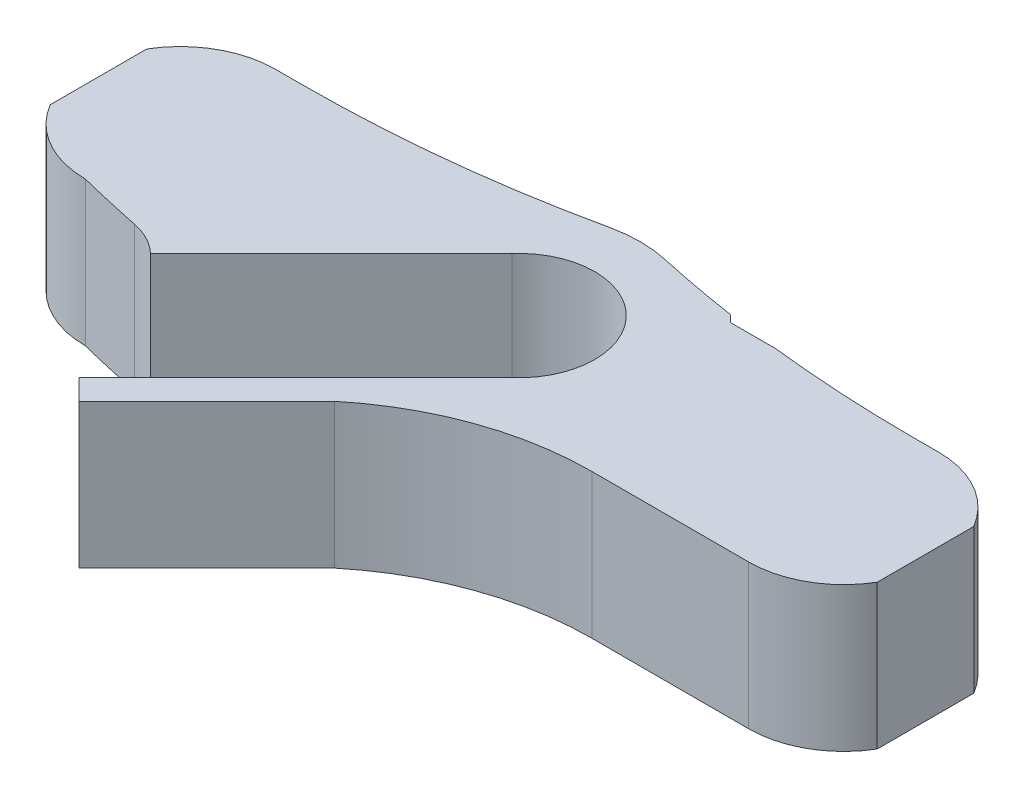
ISO-10303-21;
HEADER;
FILE_DESCRIPTION(('STEP AP214'),'2;1');
FILE_NAME('part.step','',(''),(''),'','','');
FILE_SCHEMA(('AUTOMOTIVE_DESIGN { 1 0 10303 214 1 1 1 1 }'));
ENDSEC;
DATA;
#1=APPLICATION_CONTEXT('core data for automotive mechanical design processes');
#2=APPLICATION_PROTOCOL_DEFINITION('international standard','automotive_design',2000,#1);
#3=PRODUCT_CONTEXT('',#1,'mechanical');
#4=PRODUCT('Part','Part','',(#3));
#5=PRODUCT_RELATED_PRODUCT_CATEGORY('part','',(#4));
#6=PRODUCT_DEFINITION_FORMATION('','',#4);
#7=PRODUCT_DEFINITION_CONTEXT('part definition',#1,'design');
#8=PRODUCT_DEFINITION('design','',#6,#7);
#9=PRODUCT_DEFINITION_SHAPE('','',#8);
#10=(LENGTH_UNIT() NAMED_UNIT(*) SI_UNIT(.MILLI.,.METRE.));
#11=(NAMED_UNIT(*) PLANE_ANGLE_UNIT() SI_UNIT($,.RADIAN.));
#12=(NAMED_UNIT(*) SI_UNIT($,.STERADIAN.) SOLID_ANGLE_UNIT());
#13=UNCERTAINTY_MEASURE_WITH_UNIT(LENGTH_MEASURE(1.E-05),#10,'distance_accuracy_value','');
#14=(GEOMETRIC_REPRESENTATION_CONTEXT(3) GLOBAL_UNCERTAINTY_ASSIGNED_CONTEXT((#13)) GLOBAL_UNIT_ASSIGNED_CONTEXT((#10,
#11,#12)) REPRESENTATION_CONTEXT('',''));
#15=CARTESIAN_POINT('',(0.,0.,0.));
#16=DIRECTION('',(0.,0.,1.));
#17=DIRECTION('',(1.,0.,0.));
#18=AXIS2_PLACEMENT_3D('',#15,#16,#17);
#19=CARTESIAN_POINT('',(46.2675514036826,10.5,28.5920986413207));
#20=DIRECTION('',(0.,-1.,0.));
#21=DIRECTION('',(0.,0.,-1.));
#22=AXIS2_PLACEMENT_3D('',#19,#20,#21);
#23=CYLINDRICAL_SURFACE('',#22,21.685333675265);
#24=CARTESIAN_POINT('',(46.2675514036826,0.,28.5920986413207));
#25=DIRECTION('',(0.,1.,0.));
#26=DIRECTION('',(0.,0.,1.));
#27=AXIS2_PLACEMENT_3D('',#24,#25,#26);
#28=CIRCLE('',#27,21.685333675265);
#29=CARTESIAN_POINT('',(46.2675514036826,0.,6.90676496605569));
#30=VERTEX_POINT('',#29);
#31=CARTESIAN_POINT('',(32.4923497371638,0.,11.8440385848747));
#32=VERTEX_POINT('',#31);
#33=EDGE_CURVE('E391',#30,#32,#28,.T.);
#34=ORIENTED_EDGE('',*,*,#33,.F.);
#35=DIRECTION('',(0.,-1.,0.));
#36=VECTOR('',#35,1.);
#37=CARTESIAN_POINT('',(46.2675514036826,10.5,6.90676496605569));
#38=LINE('',#37,#36);
#39=CARTESIAN_POINT('',(46.2675514036826,10.5,6.90676496605569));
#40=VERTEX_POINT('',#39);
#41=EDGE_CURVE('E518',#40,#30,#38,.T.);
#42=ORIENTED_EDGE('',*,*,#41,.F.);
#43=CARTESIAN_POINT('',(46.2675514036826,10.5,28.5920986413207));
#44=DIRECTION('',(0.,1.,0.));
#45=DIRECTION('',(0.,0.,1.));
#46=AXIS2_PLACEMENT_3D('',#43,#44,#45);
#47=CIRCLE('',#46,21.685333675265);
#48=CARTESIAN_POINT('',(32.4923497371638,10.5,11.8440385848747));
#49=VERTEX_POINT('',#48);
#50=EDGE_CURVE('E326',#40,#49,#47,.T.);
#51=ORIENTED_EDGE('',*,*,#50,.T.);
#52=DIRECTION('',(0.,-1.,0.));
#53=VECTOR('',#52,1.);
#54=CARTESIAN_POINT('',(32.4923497371638,10.5,11.8440385848747));
#55=LINE('',#54,#53);
#56=EDGE_CURVE('E292',#49,#32,#55,.T.);
#57=ORIENTED_EDGE('',*,*,#56,.T.);
#58=EDGE_LOOP('',(#34,#42,#51,#57));
#59=FACE_BOUND('',#58,.T.);
#60=ADVANCED_FACE('F125',(#59),#23,.F.);
#61=CARTESIAN_POINT('',(0.,10.5,6.90676496605569));
#62=DIRECTION('',(0.,0.,1.));
#63=DIRECTION('',(1.,0.,0.));
#64=AXIS2_PLACEMENT_3D('',#61,#62,#63);
#65=PLANE('',#64);
#66=DIRECTION('',(-1.,0.,0.));
#67=VECTOR('',#66,1.);
#68=CARTESIAN_POINT('',(0.,0.,6.90676496605569));
#69=LINE('',#68,#67);
#70=CARTESIAN_POINT('',(57.65,0.,6.90676496605569));
#71=VERTEX_POINT('',#70);
#72=EDGE_CURVE('E395',#71,#30,#69,.T.);
#73=ORIENTED_EDGE('',*,*,#72,.F.);
#74=DIRECTION('',(0.,-1.,0.));
#75=VECTOR('',#74,1.);
#76=CARTESIAN_POINT('',(57.65,10.5,6.90676496605569));
#77=LINE('',#76,#75);
#78=CARTESIAN_POINT('',(57.65,10.5,6.90676496605569));
#79=VERTEX_POINT('',#78);
#80=EDGE_CURVE('E515',#79,#71,#77,.T.);
#81=ORIENTED_EDGE('',*,*,#80,.F.);
#82=DIRECTION('',(-1.,0.,0.));
#83=VECTOR('',#82,1.);
#84=CARTESIAN_POINT('',(0.,10.5,6.90676496605569));
#85=LINE('',#84,#83);
#86=EDGE_CURVE('E330',#79,#40,#85,.T.);
#87=ORIENTED_EDGE('',*,*,#86,.T.);
#88=ORIENTED_EDGE('',*,*,#41,.T.);
#89=EDGE_LOOP('',(#73,#81,#87,#88));
#90=FACE_BOUND('',#89,.T.);
#91=ADVANCED_FACE('F555',(#90),#65,.T.);
#92=CARTESIAN_POINT('',(57.65,10.5,0.));
#93=DIRECTION('',(0.,-1.,0.));
#94=DIRECTION('',(0.,0.,-1.));
#95=AXIS2_PLACEMENT_3D('',#92,#93,#94);
#96=CYLINDRICAL_SURFACE('',#95,6.90676496605569);
#97=CARTESIAN_POINT('',(57.65,0.,0.));
#98=DIRECTION('',(0.,1.,0.));
#99=DIRECTION('',(0.,0.,1.));
#100=AXIS2_PLACEMENT_3D('',#97,#98,#99);
#101=CIRCLE('',#100,6.90676496605569);
#102=CARTESIAN_POINT('',(63.6,0.,3.50726421820973));
#103=VERTEX_POINT('',#102);
#104=EDGE_CURVE('E400',#71,#103,#101,.T.);
#105=ORIENTED_EDGE('',*,*,#104,.T.);
#106=DIRECTION('',(0.,-1.,0.));
#107=VECTOR('',#106,1.);
#108=CARTESIAN_POINT('',(63.6,10.5,3.50726421820973));
#109=LINE('',#108,#107);
#110=CARTESIAN_POINT('',(63.6,10.5,3.50726421820973));
#111=VERTEX_POINT('',#110);
#112=EDGE_CURVE('E512',#111,#103,#109,.T.);
#113=ORIENTED_EDGE('',*,*,#112,.F.);
#114=CARTESIAN_POINT('',(57.65,10.5,0.));
#115=DIRECTION('',(0.,1.,0.));
#116=DIRECTION('',(0.,0.,1.));
#117=AXIS2_PLACEMENT_3D('',#114,#115,#116);
#118=CIRCLE('',#117,6.90676496605569);
#119=EDGE_CURVE('E334',#79,#111,#118,.T.);
#120=ORIENTED_EDGE('',*,*,#119,.F.);
#121=ORIENTED_EDGE('',*,*,#80,.T.);
#122=EDGE_LOOP('',(#105,#113,#120,#121));
#123=FACE_BOUND('',#122,.T.);
#124=ADVANCED_FACE('F560',(#123),#96,.T.);
#125=CARTESIAN_POINT('',(63.6,10.5,0.));
#126=DIRECTION('',(1.,0.,0.));
#127=DIRECTION('',(0.,0.,-1.));
#128=AXIS2_PLACEMENT_3D('',#125,#126,#127);
#129=PLANE('',#128);
#130=DIRECTION('',(0.,0.,1.));
#131=VECTOR('',#130,1.);
#132=CARTESIAN_POINT('',(63.6,0.,0.));
#133=LINE('',#132,#131);
#134=CARTESIAN_POINT('',(63.6,0.,-3.50726421820973));
#135=VERTEX_POINT('',#134);
#136=EDGE_CURVE('E404',#135,#103,#133,.T.);
#137=ORIENTED_EDGE('',*,*,#136,.F.);
#138=DIRECTION('',(0.,-1.,0.));
#139=VECTOR('',#138,1.);
#140=CARTESIAN_POINT('',(63.6,10.5,-3.50726421820973));
#141=LINE('',#140,#139);
#142=CARTESIAN_POINT('',(63.6,10.5,-3.50726421820973));
#143=VERTEX_POINT('',#142);
#144=EDGE_CURVE('E509',#143,#135,#141,.T.);
#145=ORIENTED_EDGE('',*,*,#144,.F.);
#146=DIRECTION('',(0.,0.,1.));
#147=VECTOR('',#146,1.);
#148=CARTESIAN_POINT('',(63.6,10.5,0.));
#149=LINE('',#148,#147);
#150=EDGE_CURVE('E337',#143,#111,#149,.T.);
#151=ORIENTED_EDGE('',*,*,#150,.T.);
#152=ORIENTED_EDGE('',*,*,#112,.T.);
#153=EDGE_LOOP('',(#137,#145,#151,#152));
#154=FACE_BOUND('',#153,.T.);
#155=ADVANCED_FACE('F564',(#154),#129,.T.);
#156=CARTESIAN_POINT('',(57.65,10.5,0.));
#157=DIRECTION('',(0.,-1.,0.));
#158=DIRECTION('',(0.,0.,-1.));
#159=AXIS2_PLACEMENT_3D('',#156,#157,#158);
#160=CYLINDRICAL_SURFACE('',#159,6.90676496605569);
#161=CARTESIAN_POINT('',(57.65,0.,0.));
#162=DIRECTION('',(0.,1.,0.));
#163=DIRECTION('',(0.,0.,1.));
#164=AXIS2_PLACEMENT_3D('',#161,#162,#163);
#165=CIRCLE('',#164,6.90676496605569);
#166=CARTESIAN_POINT('',(57.65,0.,-6.90676496605569));
#167=VERTEX_POINT('',#166);
#168=EDGE_CURVE('E408',#135,#167,#165,.T.);
#169=ORIENTED_EDGE('',*,*,#168,.T.);
#170=DIRECTION('',(0.,-1.,0.));
#171=VECTOR('',#170,1.);
#172=CARTESIAN_POINT('',(57.65,10.5,-6.90676496605569));
#173=LINE('',#172,#171);
#174=CARTESIAN_POINT('',(57.65,10.5,-6.90676496605569));
#175=VERTEX_POINT('',#174);
#176=EDGE_CURVE('E505',#175,#167,#173,.T.);
#177=ORIENTED_EDGE('',*,*,#176,.F.);
#178=CARTESIAN_POINT('',(57.65,10.5,0.));
#179=DIRECTION('',(0.,1.,0.));
#180=DIRECTION('',(0.,0.,1.));
#181=AXIS2_PLACEMENT_3D('',#178,#179,#180);
#182=CIRCLE('',#181,6.90676496605569);
#183=EDGE_CURVE('E341',#143,#175,#182,.T.);
#184=ORIENTED_EDGE('',*,*,#183,.F.);
#185=ORIENTED_EDGE('',*,*,#144,.T.);
#186=EDGE_LOOP('',(#169,#177,#184,#185));
#187=FACE_BOUND('',#186,.T.);
#188=ADVANCED_FACE('F569',(#187),#160,.T.);
#189=CARTESIAN_POINT('',(0.,10.5,-6.90676496605561));
#190=DIRECTION('',(0.,0.,1.));
#191=DIRECTION('',(1.,0.,0.));
#192=AXIS2_PLACEMENT_3D('',#189,#190,#191);
#193=PLANE('',#192);
#194=DIRECTION('',(-1.,0.,0.));
#195=VECTOR('',#194,1.);
#196=CARTESIAN_POINT('',(0.,0.,-6.90676496605561));
#197=LINE('',#196,#195);
#198=CARTESIAN_POINT('',(55.7709312115132,0.,-6.90676496605569));
#199=VERTEX_POINT('',#198);
#200=EDGE_CURVE('E411',#167,#199,#197,.T.);
#201=ORIENTED_EDGE('',*,*,#200,.T.);
#202=DIRECTION('',(0.,-1.,0.));
#203=VECTOR('',#202,1.);
#204=CARTESIAN_POINT('',(55.7709312115132,10.5,-6.90676496605569));
#205=LINE('',#204,#203);
#206=CARTESIAN_POINT('',(55.7709312115132,10.5,-6.90676496605569));
#207=VERTEX_POINT('',#206);
#208=EDGE_CURVE('E502',#207,#199,#205,.T.);
#209=ORIENTED_EDGE('',*,*,#208,.F.);
#210=DIRECTION('',(-1.,0.,0.));
#211=VECTOR('',#210,1.);
#212=CARTESIAN_POINT('',(0.,10.5,-6.90676496605561));
#213=LINE('',#212,#211);
#214=EDGE_CURVE('E344',#175,#207,#213,.T.);
#215=ORIENTED_EDGE('',*,*,#214,.F.);
#216=ORIENTED_EDGE('',*,*,#176,.T.);
#217=EDGE_LOOP('',(#201,#209,#215,#216));
#218=FACE_BOUND('',#217,.T.);
#219=ADVANCED_FACE('F575',(#218),#193,.F.);
#220=CARTESIAN_POINT('',(55.7709312115132,10.5,-101.406764966056));
#221=DIRECTION('',(0.,-1.,0.));
#222=DIRECTION('',(0.,0.,-1.));
#223=AXIS2_PLACEMENT_3D('',#220,#221,#222);
#224=CYLINDRICAL_SURFACE('',#223,94.5);
#225=CARTESIAN_POINT('',(55.7709312115132,0.,-101.406764966056));
#226=DIRECTION('',(0.,1.,0.));
#227=DIRECTION('',(0.,0.,1.));
#228=AXIS2_PLACEMENT_3D('',#225,#226,#227);
#229=CIRCLE('',#228,94.5);
#230=CARTESIAN_POINT('',(45.1988219796724,0.,-7.49999999999999));
#231=VERTEX_POINT('',#230);
#232=EDGE_CURVE('E415',#231,#199,#229,.T.);
#233=ORIENTED_EDGE('',*,*,#232,.F.);
#234=DIRECTION('',(0.,-1.,0.));
#235=VECTOR('',#234,1.);
#236=CARTESIAN_POINT('',(45.1988219796724,10.5,-7.49999999999999));
#237=LINE('',#236,#235);
#238=CARTESIAN_POINT('',(45.1988219796724,10.5,-7.49999999999999));
#239=VERTEX_POINT('',#238);
#240=EDGE_CURVE('E499',#239,#231,#237,.T.);
#241=ORIENTED_EDGE('',*,*,#240,.F.);
#242=CARTESIAN_POINT('',(55.7709312115132,10.5,-101.406764966056));
#243=DIRECTION('',(0.,1.,0.));
#244=DIRECTION('',(0.,0.,1.));
#245=AXIS2_PLACEMENT_3D('',#242,#243,#244);
#246=CIRCLE('',#245,94.5);
#247=EDGE_CURVE('E347',#239,#207,#246,.T.);
#248=ORIENTED_EDGE('',*,*,#247,.T.);
#249=ORIENTED_EDGE('',*,*,#208,.T.);
#250=EDGE_LOOP('',(#233,#241,#248,#249));
#251=FACE_BOUND('',#250,.T.);
#252=ADVANCED_FACE('F579',(#251),#224,.F.);
#253=CARTESIAN_POINT('',(0.,10.5,-7.5));
#254=DIRECTION('',(0.,0.,-1.));
#255=DIRECTION('',(-1.,0.,0.));
#256=AXIS2_PLACEMENT_3D('',#253,#254,#255);
#257=PLANE('',#256);
#258=DIRECTION('',(1.,0.,0.));
#259=VECTOR('',#258,1.);
#260=CARTESIAN_POINT('',(0.,0.,-7.5));
#261=LINE('',#260,#259);
#262=CARTESIAN_POINT('',(41.924547237638,0.,-7.5));
#263=VERTEX_POINT('',#262);
#264=EDGE_CURVE('E419',#263,#231,#261,.T.);
#265=ORIENTED_EDGE('',*,*,#264,.F.);
#266=DIRECTION('',(0.,-1.,0.));
#267=VECTOR('',#266,1.);
#268=CARTESIAN_POINT('',(41.924547237638,10.5,-7.5));
#269=LINE('',#268,#267);
#270=CARTESIAN_POINT('',(41.924547237638,10.5,-7.5));
#271=VERTEX_POINT('',#270);
#272=EDGE_CURVE('E496',#271,#263,#269,.T.);
#273=ORIENTED_EDGE('',*,*,#272,.F.);
#274=DIRECTION('',(1.,0.,0.));
#275=VECTOR('',#274,1.);
#276=CARTESIAN_POINT('',(0.,10.5,-7.5));
#277=LINE('',#276,#275);
#278=EDGE_CURVE('E351',#271,#239,#277,.T.);
#279=ORIENTED_EDGE('',*,*,#278,.T.);
#280=ORIENTED_EDGE('',*,*,#240,.T.);
#281=EDGE_LOOP('',(#265,#273,#279,#280));
#282=FACE_BOUND('',#281,.T.);
#283=ADVANCED_FACE('F582',(#282),#257,.T.);
#284=CARTESIAN_POINT('',(24.7122736188192,10.5,-24.712273618819));
#285=DIRECTION('',(0.707106781186551,0.,-0.707106781186544));
#286=DIRECTION('',(-0.707106781186544,0.,-0.707106781186551));
#287=AXIS2_PLACEMENT_3D('',#284,#285,#286);
#288=PLANE('',#287);
#289=DIRECTION('',(0.707106781186544,0.,0.707106781186551));
#290=VECTOR('',#289,1.);
#291=CARTESIAN_POINT('',(24.7122736188192,0.,-24.712273618819));
#292=LINE('',#291,#290);
#293=CARTESIAN_POINT('',(41.4220650406924,0.,-8.00248219694561));
#294=VERTEX_POINT('',#293);
#295=EDGE_CURVE('E423',#294,#263,#292,.T.);
#296=ORIENTED_EDGE('',*,*,#295,.F.);
#297=DIRECTION('',(0.,-1.,0.));
#298=VECTOR('',#297,1.);
#299=CARTESIAN_POINT('',(41.4220650406924,10.5,-8.00248219694561));
#300=LINE('',#299,#298);
#301=CARTESIAN_POINT('',(41.4220650406924,10.5,-8.00248219694561));
#302=VERTEX_POINT('',#301);
#303=EDGE_CURVE('E493',#302,#294,#300,.T.);
#304=ORIENTED_EDGE('',*,*,#303,.F.);
#305=DIRECTION('',(0.707106781186544,0.,0.707106781186551));
#306=VECTOR('',#305,1.);
#307=CARTESIAN_POINT('',(24.7122736188192,10.5,-24.712273618819));
#308=LINE('',#307,#306);
#309=EDGE_CURVE('E355',#302,#271,#308,.T.);
#310=ORIENTED_EDGE('',*,*,#309,.T.);
#311=ORIENTED_EDGE('',*,*,#272,.T.);
#312=EDGE_LOOP('',(#296,#304,#310,#311));
#313=FACE_BOUND('',#312,.T.);
#314=ADVANCED_FACE('F587',(#313),#288,.T.);
#315=CARTESIAN_POINT('',(55.7709312115132,10.5,-101.406764966056));
#316=DIRECTION('',(0.,-1.,0.));
#317=DIRECTION('',(0.,0.,-1.));
#318=AXIS2_PLACEMENT_3D('',#315,#316,#317);
#319=CYLINDRICAL_SURFACE('',#318,94.5);
#320=CARTESIAN_POINT('',(55.7709312115132,0.,-101.406764966056));
#321=DIRECTION('',(0.,1.,0.));
#322=DIRECTION('',(0.,0.,1.));
#323=AXIS2_PLACEMENT_3D('',#320,#321,#322);
#324=CIRCLE('',#323,94.5);
#325=CARTESIAN_POINT('',(35.5433910765038,0.,-9.09697881048829));
#326=VERTEX_POINT('',#325);
#327=EDGE_CURVE('E427',#326,#294,#324,.T.);
#328=ORIENTED_EDGE('',*,*,#327,.F.);
#329=DIRECTION('',(0.,-1.,0.));
#330=VECTOR('',#329,1.);
#331=CARTESIAN_POINT('',(35.5433910765038,10.5,-9.09697881048829));
#332=LINE('',#331,#330);
#333=CARTESIAN_POINT('',(35.5433910765038,10.5,-9.09697881048829));
#334=VERTEX_POINT('',#333);
#335=EDGE_CURVE('E490',#334,#326,#332,.T.);
#336=ORIENTED_EDGE('',*,*,#335,.F.);
#337=CARTESIAN_POINT('',(55.7709312115132,10.5,-101.406764966056));
#338=DIRECTION('',(0.,1.,0.));
#339=DIRECTION('',(0.,0.,1.));
#340=AXIS2_PLACEMENT_3D('',#337,#338,#339);
#341=CIRCLE('',#340,94.5);
#342=EDGE_CURVE('E359',#334,#302,#341,.T.);
#343=ORIENTED_EDGE('',*,*,#342,.T.);
#344=ORIENTED_EDGE('',*,*,#303,.T.);
#345=EDGE_LOOP('',(#328,#336,#343,#344));
#346=FACE_BOUND('',#345,.T.);
#347=ADVANCED_FACE('F590',(#346),#319,.F.);
#348=CARTESIAN_POINT('',(33.55,10.5,0.));
#349=DIRECTION('',(0.,-1.,0.));
#350=DIRECTION('',(0.,0.,-1.));
#351=AXIS2_PLACEMENT_3D('',#348,#349,#350);
#352=CYLINDRICAL_SURFACE('',#351,9.312820811245);
#353=CARTESIAN_POINT('',(33.55,0.,0.));
#354=DIRECTION('',(0.,1.,0.));
#355=DIRECTION('',(0.,0.,1.));
#356=AXIS2_PLACEMENT_3D('',#353,#354,#355);
#357=CIRCLE('',#356,9.312820811245);
#358=CARTESIAN_POINT('',(31.5566089234962,0.,-9.09697881048831));
#359=VERTEX_POINT('',#358);
#360=EDGE_CURVE('E431',#326,#359,#357,.T.);
#361=ORIENTED_EDGE('',*,*,#360,.T.);
#362=DIRECTION('',(0.,-1.,0.));
#363=VECTOR('',#362,1.);
#364=CARTESIAN_POINT('',(31.5566089234962,10.5,-9.09697881048831));
#365=LINE('',#364,#363);
#366=CARTESIAN_POINT('',(31.5566089234962,10.5,-9.09697881048831));
#367=VERTEX_POINT('',#366);
#368=EDGE_CURVE('E487',#367,#359,#365,.T.);
#369=ORIENTED_EDGE('',*,*,#368,.F.);
#370=CARTESIAN_POINT('',(33.55,10.5,0.));
#371=DIRECTION('',(0.,1.,0.));
#372=DIRECTION('',(0.,0.,1.));
#373=AXIS2_PLACEMENT_3D('',#370,#371,#372);
#374=CIRCLE('',#373,9.312820811245);
#375=EDGE_CURVE('E363',#334,#367,#374,.T.);
#376=ORIENTED_EDGE('',*,*,#375,.F.);
#377=ORIENTED_EDGE('',*,*,#335,.T.);
#378=EDGE_LOOP('',(#361,#369,#376,#377));
#379=FACE_BOUND('',#378,.T.);
#380=ADVANCED_FACE('F596',(#379),#352,.T.);
#381=CARTESIAN_POINT('',(11.3290687884867,10.5,-101.406764966056));
#382=DIRECTION('',(0.,-1.,0.));
#383=DIRECTION('',(0.,0.,-1.));
#384=AXIS2_PLACEMENT_3D('',#381,#382,#383);
#385=CYLINDRICAL_SURFACE('',#384,94.5);
#386=CARTESIAN_POINT('',(11.3290687884867,0.,-101.406764966056));
#387=DIRECTION('',(0.,1.,0.));
#388=DIRECTION('',(0.,0.,1.));
#389=AXIS2_PLACEMENT_3D('',#386,#387,#388);
#390=CIRCLE('',#389,94.5);
#391=CARTESIAN_POINT('',(11.3290687884868,0.,-6.90676496605569));
#392=VERTEX_POINT('',#391);
#393=EDGE_CURVE('E435',#392,#359,#390,.T.);
#394=ORIENTED_EDGE('',*,*,#393,.F.);
#395=DIRECTION('',(0.,-1.,0.));
#396=VECTOR('',#395,1.);
#397=CARTESIAN_POINT('',(11.3290687884868,10.5,-6.90676496605569));
#398=LINE('',#397,#396);
#399=CARTESIAN_POINT('',(11.3290687884868,10.5,-6.90676496605569));
#400=VERTEX_POINT('',#399);
#401=EDGE_CURVE('E484',#400,#392,#398,.T.);
#402=ORIENTED_EDGE('',*,*,#401,.F.);
#403=CARTESIAN_POINT('',(11.3290687884867,10.5,-101.406764966056));
#404=DIRECTION('',(0.,1.,0.));
#405=DIRECTION('',(0.,0.,1.));
#406=AXIS2_PLACEMENT_3D('',#403,#404,#405);
#407=CIRCLE('',#406,94.5);
#408=EDGE_CURVE('E366',#400,#367,#407,.T.);
#409=ORIENTED_EDGE('',*,*,#408,.T.);
#410=ORIENTED_EDGE('',*,*,#368,.T.);
#411=EDGE_LOOP('',(#394,#402,#409,#410));
#412=FACE_BOUND('',#411,.T.);
#413=ADVANCED_FACE('F600',(#412),#385,.F.);
#414=CARTESIAN_POINT('',(0.,10.5,-6.90676496605569));
#415=DIRECTION('',(0.,0.,-1.));
#416=DIRECTION('',(-1.,0.,0.));
#417=AXIS2_PLACEMENT_3D('',#414,#415,#416);
#418=PLANE('',#417);
#419=DIRECTION('',(1.,0.,0.));
#420=VECTOR('',#419,1.);
#421=CARTESIAN_POINT('',(0.,0.,-6.90676496605569));
#422=LINE('',#421,#420);
#423=CARTESIAN_POINT('',(9.45000000000001,0.,-6.90676496605569));
#424=VERTEX_POINT('',#423);
#425=EDGE_CURVE('E439',#424,#392,#422,.T.);
#426=ORIENTED_EDGE('',*,*,#425,.F.);
#427=DIRECTION('',(0.,-1.,0.));
#428=VECTOR('',#427,1.);
#429=CARTESIAN_POINT('',(9.45000000000001,10.5,-6.90676496605569));
#430=LINE('',#429,#428);
#431=CARTESIAN_POINT('',(9.45000000000001,10.5,-6.90676496605569));
#432=VERTEX_POINT('',#431);
#433=EDGE_CURVE('E481',#432,#424,#430,.T.);
#434=ORIENTED_EDGE('',*,*,#433,.F.);
#435=DIRECTION('',(1.,0.,0.));
#436=VECTOR('',#435,1.);
#437=CARTESIAN_POINT('',(0.,10.5,-6.90676496605569));
#438=LINE('',#437,#436);
#439=EDGE_CURVE('E370',#432,#400,#438,.T.);
#440=ORIENTED_EDGE('',*,*,#439,.T.);
#441=ORIENTED_EDGE('',*,*,#401,.T.);
#442=EDGE_LOOP('',(#426,#434,#440,#441));
#443=FACE_BOUND('',#442,.T.);
#444=ADVANCED_FACE('F603',(#443),#418,.T.);
#445=CARTESIAN_POINT('',(9.45000000000001,10.5,0.));
#446=DIRECTION('',(0.,-1.,0.));
#447=DIRECTION('',(0.,0.,-1.));
#448=AXIS2_PLACEMENT_3D('',#445,#446,#447);
#449=CYLINDRICAL_SURFACE('',#448,6.9067649660557);
#450=CARTESIAN_POINT('',(9.45000000000001,0.,0.));
#451=DIRECTION('',(0.,1.,0.));
#452=DIRECTION('',(0.,0.,1.));
#453=AXIS2_PLACEMENT_3D('',#450,#451,#452);
#454=CIRCLE('',#453,6.9067649660557);
#455=CARTESIAN_POINT('',(3.5,0.,-3.50726421820971));
#456=VERTEX_POINT('',#455);
#457=EDGE_CURVE('E443',#456,#424,#454,.F.);
#458=ORIENTED_EDGE('',*,*,#457,.F.);
#459=DIRECTION('',(0.,-1.,0.));
#460=VECTOR('',#459,1.);
#461=CARTESIAN_POINT('',(3.5,10.5,-3.50726421820971));
#462=LINE('',#461,#460);
#463=CARTESIAN_POINT('',(3.5,10.5,-3.50726421820971));
#464=VERTEX_POINT('',#463);
#465=EDGE_CURVE('E478',#464,#456,#462,.T.);
#466=ORIENTED_EDGE('',*,*,#465,.F.);
#467=CARTESIAN_POINT('',(9.45000000000001,10.5,0.));
#468=DIRECTION('',(0.,1.,0.));
#469=DIRECTION('',(0.,0.,1.));
#470=AXIS2_PLACEMENT_3D('',#467,#468,#469);
#471=CIRCLE('',#470,6.9067649660557);
#472=EDGE_CURVE('E374',#464,#432,#471,.F.);
#473=ORIENTED_EDGE('',*,*,#472,.T.);
#474=ORIENTED_EDGE('',*,*,#433,.T.);
#475=EDGE_LOOP('',(#458,#466,#473,#474));
#476=FACE_BOUND('',#475,.T.);
#477=ADVANCED_FACE('F607',(#476),#449,.T.);
#478=CARTESIAN_POINT('',(3.5,10.5,0.));
#479=DIRECTION('',(1.,0.,0.));
#480=DIRECTION('',(0.,0.,-1.));
#481=AXIS2_PLACEMENT_3D('',#478,#479,#480);
#482=PLANE('',#481);
#483=DIRECTION('',(0.,0.,1.));
#484=VECTOR('',#483,1.);
#485=CARTESIAN_POINT('',(3.5,0.,0.));
#486=LINE('',#485,#484);
#487=CARTESIAN_POINT('',(3.5,0.,3.50726421820974));
#488=VERTEX_POINT('',#487);
#489=EDGE_CURVE('E447',#456,#488,#486,.T.);
#490=ORIENTED_EDGE('',*,*,#489,.T.);
#491=DIRECTION('',(0.,-1.,0.));
#492=VECTOR('',#491,1.);
#493=CARTESIAN_POINT('',(3.5,10.5,3.50726421820974));
#494=LINE('',#493,#492);
#495=CARTESIAN_POINT('',(3.5,10.5,3.50726421820974));
#496=VERTEX_POINT('',#495);
#497=EDGE_CURVE('E475',#496,#488,#494,.T.);
#498=ORIENTED_EDGE('',*,*,#497,.F.);
#499=DIRECTION('',(0.,0.,1.));
#500=VECTOR('',#499,1.);
#501=CARTESIAN_POINT('',(3.5,10.5,0.));
#502=LINE('',#501,#500);
#503=EDGE_CURVE('E378',#464,#496,#502,.T.);
#504=ORIENTED_EDGE('',*,*,#503,.F.);
#505=ORIENTED_EDGE('',*,*,#465,.T.);
#506=EDGE_LOOP('',(#490,#498,#504,#505));
#507=FACE_BOUND('',#506,.T.);
#508=ADVANCED_FACE('F610',(#507),#482,.F.);
#509=CARTESIAN_POINT('',(9.45000000000001,10.5,0.));
#510=DIRECTION('',(0.,-1.,0.));
#511=DIRECTION('',(0.,0.,-1.));
#512=AXIS2_PLACEMENT_3D('',#509,#510,#511);
#513=CYLINDRICAL_SURFACE('',#512,6.9067649660557);
#514=CARTESIAN_POINT('',(9.45000000000001,0.,0.));
#515=DIRECTION('',(0.,1.,0.));
#516=DIRECTION('',(0.,0.,1.));
#517=AXIS2_PLACEMENT_3D('',#514,#515,#516);
#518=CIRCLE('',#517,6.9067649660557);
#519=CARTESIAN_POINT('',(9.45000000000001,0.,6.90676496605572));
#520=VERTEX_POINT('',#519);
#521=EDGE_CURVE('E451',#520,#488,#518,.F.);
#522=ORIENTED_EDGE('',*,*,#521,.F.);
#523=DIRECTION('',(0.,-1.,0.));
#524=VECTOR('',#523,1.);
#525=CARTESIAN_POINT('',(9.45000000000001,10.5,6.90676496605572));
#526=LINE('',#525,#524);
#527=CARTESIAN_POINT('',(9.45000000000001,10.5,6.90676496605572));
#528=VERTEX_POINT('',#527);
#529=EDGE_CURVE('E472',#528,#520,#526,.T.);
#530=ORIENTED_EDGE('',*,*,#529,.F.);
#531=CARTESIAN_POINT('',(9.45000000000001,10.5,0.));
#532=DIRECTION('',(0.,1.,0.));
#533=DIRECTION('',(0.,0.,1.));
#534=AXIS2_PLACEMENT_3D('',#531,#532,#533);
#535=CIRCLE('',#534,6.9067649660557);
#536=EDGE_CURVE('E381',#528,#496,#535,.F.);
#537=ORIENTED_EDGE('',*,*,#536,.T.);
#538=ORIENTED_EDGE('',*,*,#497,.T.);
#539=EDGE_LOOP('',(#522,#530,#537,#538));
#540=FACE_BOUND('',#539,.T.);
#541=ADVANCED_FACE('F535',(#540),#513,.T.);
#542=CARTESIAN_POINT('',(12.8682350339442,10.5,12.8682350339443));
#543=DIRECTION('',(0.707106781186544,0.,0.707106781186551));
#544=DIRECTION('',(0.707106781186551,0.,-0.707106781186544));
#545=AXIS2_PLACEMENT_3D('',#542,#543,#544);
#546=PLANE('',#545);
#547=DIRECTION('',(-0.707106781186551,0.,0.707106781186544));
#548=VECTOR('',#547,1.);
#549=CARTESIAN_POINT('',(12.8682350339442,0.,12.8682350339443));
#550=LINE('',#549,#548);
#551=CARTESIAN_POINT('',(29.6432350339445,0.,-3.90676496605586));
#552=VERTEX_POINT('',#551);
#553=CARTESIAN_POINT('',(16.5084430047706,0.,9.22802706311795));
#554=VERTEX_POINT('',#553);
#555=EDGE_CURVE('E455',#552,#554,#550,.T.);
#556=ORIENTED_EDGE('',*,*,#555,.F.);
#557=DIRECTION('',(0.,-1.,0.));
#558=VECTOR('',#557,1.);
#559=CARTESIAN_POINT('',(29.6432350339445,10.5,-3.90676496605586));
#560=LINE('',#559,#558);
#561=CARTESIAN_POINT('',(29.6432350339445,10.5,-3.90676496605586));
#562=VERTEX_POINT('',#561);
#563=EDGE_CURVE('E469',#562,#552,#560,.T.);
#564=ORIENTED_EDGE('',*,*,#563,.F.);
#565=DIRECTION('',(-0.707106781186551,0.,0.707106781186544));
#566=VECTOR('',#565,1.);
#567=CARTESIAN_POINT('',(12.8682350339442,10.5,12.8682350339443));
#568=LINE('',#567,#566);
#569=CARTESIAN_POINT('',(16.5084430047706,10.5,9.22802706311795));
#570=VERTEX_POINT('',#569);
#571=EDGE_CURVE('E385',#562,#570,#568,.T.);
#572=ORIENTED_EDGE('',*,*,#571,.T.);
#573=DIRECTION('',(0.,-1.,0.));
#574=VECTOR('',#573,1.);
#575=CARTESIAN_POINT('',(16.5084430047706,19.9080090445404,9.22802706311795));
#576=LINE('',#575,#574);
#577=EDGE_CURVE('E318',#570,#554,#576,.T.);
#578=ORIENTED_EDGE('',*,*,#577,.T.);
#579=EDGE_LOOP('',(#556,#564,#572,#578));
#580=FACE_BOUND('',#579,.T.);
#581=ADVANCED_FACE('F542',(#580),#546,.T.);
#582=CARTESIAN_POINT('',(33.7901154091008,10.5,-0.240115409100796));
#583=DIRECTION('',(0.,-1.,0.));
#584=DIRECTION('',(0.,0.,-1.));
#585=AXIS2_PLACEMENT_3D('',#582,#583,#584);
#586=CYLINDRICAL_SURFACE('',#585,5.53542553191488);
#587=CARTESIAN_POINT('',(33.7901154091008,0.,-0.240115409100796));
#588=DIRECTION('',(0.,1.,0.));
#589=DIRECTION('',(0.,0.,1.));
#590=AXIS2_PLACEMENT_3D('',#587,#588,#589);
#591=CIRCLE('',#590,5.53542553191488);
#592=CARTESIAN_POINT('',(37.4567649660559,0.,3.90676496605551));
#593=VERTEX_POINT('',#592);
#594=EDGE_CURVE('E459',#552,#593,#591,.F.);
#595=ORIENTED_EDGE('',*,*,#594,.T.);
#596=DIRECTION('',(0.,-1.,0.));
#597=VECTOR('',#596,1.);
#598=CARTESIAN_POINT('',(37.4567649660559,10.5,3.90676496605551));
#599=LINE('',#598,#597);
#600=CARTESIAN_POINT('',(37.4567649660559,10.5,3.90676496605551));
#601=VERTEX_POINT('',#600);
#602=EDGE_CURVE('E466',#601,#593,#599,.T.);
#603=ORIENTED_EDGE('',*,*,#602,.F.);
#604=CARTESIAN_POINT('',(33.7901154091008,10.5,-0.240115409100796));
#605=DIRECTION('',(0.,1.,0.));
#606=DIRECTION('',(0.,0.,1.));
#607=AXIS2_PLACEMENT_3D('',#604,#605,#606);
#608=CIRCLE('',#607,5.53542553191488);
#609=EDGE_CURVE('E286',#562,#601,#608,.F.);
#610=ORIENTED_EDGE('',*,*,#609,.F.);
#611=ORIENTED_EDGE('',*,*,#563,.T.);
#612=EDGE_LOOP('',(#595,#603,#610,#611));
#613=FACE_BOUND('',#612,.T.);
#614=ADVANCED_FACE('F545',(#613),#586,.F.);
#615=CARTESIAN_POINT('',(20.6817649660555,10.5,20.6817649660557));
#616=DIRECTION('',(0.707106781186544,0.,0.707106781186551));
#617=DIRECTION('',(0.707106781186551,0.,-0.707106781186544));
#618=AXIS2_PLACEMENT_3D('',#615,#616,#617);
#619=PLANE('',#618);
#620=DIRECTION('',(-0.707106781186551,0.,0.707106781186544));
#621=VECTOR('',#620,1.);
#622=CARTESIAN_POINT('',(20.6817649660555,0.,20.6817649660557));
#623=LINE('',#622,#621);
#624=CARTESIAN_POINT('',(21.7203641049199,0.,19.6431658271916));
#625=VERTEX_POINT('',#624);
#626=EDGE_CURVE('E307',#593,#625,#623,.T.);
#627=ORIENTED_EDGE('',*,*,#626,.T.);
#628=DIRECTION('',(0.,-1.,0.));
#629=VECTOR('',#628,1.);
#630=CARTESIAN_POINT('',(21.7203641049199,19.9080090445404,19.6431658271916));
#631=LINE('',#630,#629);
#632=CARTESIAN_POINT('',(21.7203641049199,10.5,19.6431658271916));
#633=VERTEX_POINT('',#632);
#634=EDGE_CURVE('E299',#633,#625,#631,.T.);
#635=ORIENTED_EDGE('',*,*,#634,.F.);
#636=DIRECTION('',(-0.707106781186551,0.,0.707106781186544));
#637=VECTOR('',#636,1.);
#638=CARTESIAN_POINT('',(20.6817649660555,10.5,20.6817649660557));
#639=LINE('',#638,#637);
#640=EDGE_CURVE('E279',#601,#633,#639,.T.);
#641=ORIENTED_EDGE('',*,*,#640,.F.);
#642=ORIENTED_EDGE('',*,*,#602,.T.);
#643=EDGE_LOOP('',(#627,#635,#641,#642));
#644=FACE_BOUND('',#643,.T.);
#645=ADVANCED_FACE('F305',(#644),#619,.F.);
#646=CARTESIAN_POINT('',(0.,10.5,0.));
#647=DIRECTION('',(0.,1.,0.));
#648=DIRECTION('',(0.,0.,1.));
#649=AXIS2_PLACEMENT_3D('',#646,#647,#648);
#650=PLANE('',#649);
#651=ORIENTED_EDGE('',*,*,#536,.F.);
#652=CARTESIAN_POINT('',(33.9924417706466,10.5,-90.0348079112936));
#653=DIRECTION('',(0.,1.,0.));
#654=DIRECTION('',(0.,0.,1.));
#655=AXIS2_PLACEMENT_3D('',#652,#653,#654);
#656=CIRCLE('',#655,100.);
#657=CARTESIAN_POINT('',(14.0863930285176,10.5,7.96391260829273));
#658=VERTEX_POINT('',#657);
#659=EDGE_CURVE('E12',#528,#658,#656,.T.);
#660=ORIENTED_EDGE('',*,*,#659,.T.);
#661=CARTESIAN_POINT('',(13.1045734717177,10.5,12.7974715729035));
#662=DIRECTION('',(0.,1.,0.));
#663=DIRECTION('',(0.,0.,1.));
#664=AXIS2_PLACEMENT_3D('',#661,#662,#663);
#665=CIRCLE('',#664,4.93226742041468);
#666=EDGE_CURVE('E319',#658,#570,#665,.F.);
#667=ORIENTED_EDGE('',*,*,#666,.T.);
#668=ORIENTED_EDGE('',*,*,#571,.F.);
#669=ORIENTED_EDGE('',*,*,#609,.T.);
#670=ORIENTED_EDGE('',*,*,#640,.T.);
#671=DIRECTION('',(-0.707106781186548,0.,-0.707106781186547));
#672=VECTOR('',#671,1.);
#673=CARTESIAN_POINT('',(1.03859913886415,10.5,-1.03859913886415));
#674=LINE('',#673,#672);
#675=CARTESIAN_POINT('',(23.2067932998834,10.5,21.1295950221551));
#676=VERTEX_POINT('',#675);
#677=EDGE_CURVE('E283',#676,#633,#674,.T.);
#678=ORIENTED_EDGE('',*,*,#677,.F.);
#679=DIRECTION('',(0.707106781186547,0.,-0.707106781186548));
#680=VECTOR('',#679,1.);
#681=CARTESIAN_POINT('',(27.2228992628522,10.5,17.1134890591863));
#682=LINE('',#681,#680);
#683=EDGE_CURVE('E396',#676,#49,#682,.T.);
#684=ORIENTED_EDGE('',*,*,#683,.T.);
#685=ORIENTED_EDGE('',*,*,#50,.F.);
#686=ORIENTED_EDGE('',*,*,#86,.F.);
#687=ORIENTED_EDGE('',*,*,#119,.T.);
#688=ORIENTED_EDGE('',*,*,#150,.F.);
#689=ORIENTED_EDGE('',*,*,#183,.T.);
#690=ORIENTED_EDGE('',*,*,#214,.T.);
#691=ORIENTED_EDGE('',*,*,#247,.F.);
#692=ORIENTED_EDGE('',*,*,#278,.F.);
#693=ORIENTED_EDGE('',*,*,#309,.F.);
#694=ORIENTED_EDGE('',*,*,#342,.F.);
#695=ORIENTED_EDGE('',*,*,#375,.T.);
#696=ORIENTED_EDGE('',*,*,#408,.F.);
#697=ORIENTED_EDGE('',*,*,#439,.F.);
#698=ORIENTED_EDGE('',*,*,#472,.F.);
#699=ORIENTED_EDGE('',*,*,#503,.T.);
#700=EDGE_LOOP('',(#651,#660,#667,#668,#669,#670,#678,#684,#685,#686,#687,#688,#689,#690,#691,
#692,#693,#694,#695,#696,#697,#698,#699));
#701=FACE_BOUND('',#700,.T.);
#702=ADVANCED_FACE('F281',(#701),#650,.T.);
#703=CARTESIAN_POINT('',(0.,0.,0.));
#704=DIRECTION('',(0.,1.,0.));
#705=DIRECTION('',(0.,0.,1.));
#706=AXIS2_PLACEMENT_3D('',#703,#704,#705);
#707=PLANE('',#706);
#708=CARTESIAN_POINT('',(13.1045734717177,0.,12.7974715729035));
#709=DIRECTION('',(0.,-1.,0.));
#710=DIRECTION('',(0.,0.,-1.));
#711=AXIS2_PLACEMENT_3D('',#708,#709,#710);
#712=CIRCLE('',#711,4.93226742041468);
#713=CARTESIAN_POINT('',(14.0863930285176,0.,7.96391260829273));
#714=VERTEX_POINT('',#713);
#715=EDGE_CURVE('E315',#714,#554,#712,.T.);
#716=ORIENTED_EDGE('',*,*,#715,.F.);
#717=CARTESIAN_POINT('',(33.9924417706466,0.,-90.0348079112936));
#718=DIRECTION('',(0.,1.,0.));
#719=DIRECTION('',(0.,0.,1.));
#720=AXIS2_PLACEMENT_3D('',#717,#718,#719);
#721=CIRCLE('',#720,100.);
#722=EDGE_CURVE('E134',#714,#520,#721,.F.);
#723=ORIENTED_EDGE('',*,*,#722,.T.);
#724=ORIENTED_EDGE('',*,*,#521,.T.);
#725=ORIENTED_EDGE('',*,*,#489,.F.);
#726=ORIENTED_EDGE('',*,*,#457,.T.);
#727=ORIENTED_EDGE('',*,*,#425,.T.);
#728=ORIENTED_EDGE('',*,*,#393,.T.);
#729=ORIENTED_EDGE('',*,*,#360,.F.);
#730=ORIENTED_EDGE('',*,*,#327,.T.);
#731=ORIENTED_EDGE('',*,*,#295,.T.);
#732=ORIENTED_EDGE('',*,*,#264,.T.);
#733=ORIENTED_EDGE('',*,*,#232,.T.);
#734=ORIENTED_EDGE('',*,*,#200,.F.);
#735=ORIENTED_EDGE('',*,*,#168,.F.);
#736=ORIENTED_EDGE('',*,*,#136,.T.);
#737=ORIENTED_EDGE('',*,*,#104,.F.);
#738=ORIENTED_EDGE('',*,*,#72,.T.);
#739=ORIENTED_EDGE('',*,*,#33,.T.);
#740=DIRECTION('',(0.707106781186547,0.,-0.707106781186548));
#741=VECTOR('',#740,1.);
#742=CARTESIAN_POINT('',(27.2228992628522,0.,17.1134890591863));
#743=LINE('',#742,#741);
#744=CARTESIAN_POINT('',(23.2067932998834,0.,21.1295950221551));
#745=VERTEX_POINT('',#744);
#746=EDGE_CURVE('E322',#745,#32,#743,.T.);
#747=ORIENTED_EDGE('',*,*,#746,.F.);
#748=DIRECTION('',(-0.707106781186548,0.,-0.707106781186547));
#749=VECTOR('',#748,1.);
#750=CARTESIAN_POINT('',(1.03859913886415,0.,-1.03859913886415));
#751=LINE('',#750,#749);
#752=EDGE_CURVE('E311',#745,#625,#751,.T.);
#753=ORIENTED_EDGE('',*,*,#752,.T.);
#754=ORIENTED_EDGE('',*,*,#626,.F.);
#755=ORIENTED_EDGE('',*,*,#594,.F.);
#756=ORIENTED_EDGE('',*,*,#555,.T.);
#757=EDGE_LOOP('',(#716,#723,#724,#725,#726,#727,#728,#729,#730,#731,#732,#733,#734,#735,#736,
#737,#738,#739,#747,#753,#754,#755,#756));
#758=FACE_BOUND('',#757,.T.);
#759=ADVANCED_FACE('F532',(#758),#707,.F.);
#760=CARTESIAN_POINT('',(27.2228992628522,10.5,17.1134890591863));
#761=DIRECTION('',(-0.707106781186548,0.,-0.707106781186547));
#762=DIRECTION('',(-0.707106781186547,0.,0.707106781186548));
#763=AXIS2_PLACEMENT_3D('',#760,#761,#762);
#764=PLANE('',#763);
#765=ORIENTED_EDGE('',*,*,#746,.T.);
#766=ORIENTED_EDGE('',*,*,#56,.F.);
#767=ORIENTED_EDGE('',*,*,#683,.F.);
#768=DIRECTION('',(0.,-1.,0.));
#769=VECTOR('',#768,1.);
#770=CARTESIAN_POINT('',(23.2067932998834,19.9080090445404,21.1295950221551));
#771=LINE('',#770,#769);
#772=EDGE_CURVE('E302',#676,#745,#771,.T.);
#773=ORIENTED_EDGE('',*,*,#772,.T.);
#774=EDGE_LOOP('',(#765,#766,#767,#773));
#775=FACE_BOUND('',#774,.T.);
#776=ADVANCED_FACE('F549',(#775),#764,.F.);
#777=CARTESIAN_POINT('',(13.1045734717177,19.9080090445404,12.7974715729035));
#778=DIRECTION('',(0.,-1.,0.));
#779=DIRECTION('',(0.,0.,-1.));
#780=AXIS2_PLACEMENT_3D('',#777,#778,#779);
#781=CYLINDRICAL_SURFACE('',#780,4.93226742041468);
#782=ORIENTED_EDGE('',*,*,#666,.F.);
#783=DIRECTION('',(0.,-1.,0.));
#784=VECTOR('',#783,1.);
#785=CARTESIAN_POINT('',(14.0863930285176,19.9080090445404,7.96391260829272));
#786=LINE('',#785,#784);
#787=EDGE_CURVE('E521',#658,#714,#786,.T.);
#788=ORIENTED_EDGE('',*,*,#787,.T.);
#789=ORIENTED_EDGE('',*,*,#715,.T.);
#790=ORIENTED_EDGE('',*,*,#577,.F.);
#791=EDGE_LOOP('',(#782,#788,#789,#790));
#792=FACE_BOUND('',#791,.T.);
#793=ADVANCED_FACE('F538',(#792),#781,.F.);
#794=CARTESIAN_POINT('',(1.03859913886415,19.9080090445404,-1.03859913886415));
#795=DIRECTION('',(-0.707106781186547,0.,0.707106781186548));
#796=DIRECTION('',(0.707106781186548,0.,0.707106781186547));
#797=AXIS2_PLACEMENT_3D('',#794,#795,#796);
#798=PLANE('',#797);
#799=ORIENTED_EDGE('',*,*,#772,.F.);
#800=ORIENTED_EDGE('',*,*,#677,.T.);
#801=ORIENTED_EDGE('',*,*,#634,.T.);
#802=ORIENTED_EDGE('',*,*,#752,.F.);
#803=EDGE_LOOP('',(#799,#800,#801,#802));
#804=FACE_BOUND('',#803,.T.);
#805=ADVANCED_FACE('F297',(#804),#798,.T.);
#806=CARTESIAN_POINT('',(33.9924417706466,10.5,-90.0348079112936));
#807=DIRECTION('',(0.,-1.,0.));
#808=DIRECTION('',(0.,0.,-1.));
#809=AXIS2_PLACEMENT_3D('',#806,#807,#808);
#810=CYLINDRICAL_SURFACE('',#809,100.);
#811=ORIENTED_EDGE('',*,*,#659,.F.);
#812=ORIENTED_EDGE('',*,*,#529,.T.);
#813=ORIENTED_EDGE('',*,*,#722,.F.);
#814=ORIENTED_EDGE('',*,*,#787,.F.);
#815=EDGE_LOOP('',(#811,#812,#813,#814));
#816=FACE_BOUND('',#815,.T.);
#817=ADVANCED_FACE('F127',(#816),#810,.T.);
#818=CLOSED_SHELL('',(#60,#91,#124,#155,#188,#219,#252,#283,#314,#347,#380,#413,#444,#477,#508,
#541,#581,#614,#645,#702,#759,#776,#793,#805,#817));
#819=MANIFOLD_SOLID_BREP('B2',#818);
#820=ADVANCED_BREP_SHAPE_REPRESENTATION('',(#18,#819),#14);
#821=SHAPE_DEFINITION_REPRESENTATION(#9,#820);
ENDSEC;
END-ISO-10303-21;
